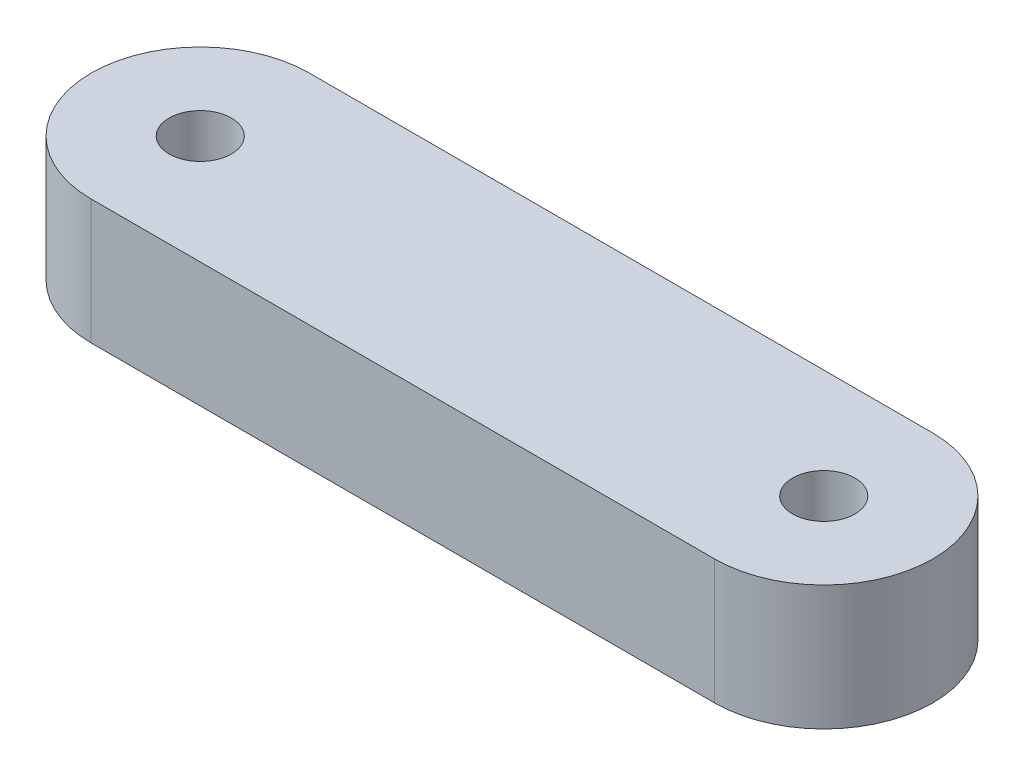
ISO-10303-21;
HEADER;
FILE_DESCRIPTION(('STEP AP214'),'2;1');
FILE_NAME('part.step','',(''),(''),'','','');
FILE_SCHEMA(('AUTOMOTIVE_DESIGN { 1 0 10303 214 1 1 1 1 }'));
ENDSEC;
DATA;
#1=APPLICATION_CONTEXT('core data for automotive mechanical design processes');
#2=APPLICATION_PROTOCOL_DEFINITION('international standard','automotive_design',2000,#1);
#3=PRODUCT_CONTEXT('',#1,'mechanical');
#4=PRODUCT('Part','Part','',(#3));
#5=PRODUCT_RELATED_PRODUCT_CATEGORY('part','',(#4));
#6=PRODUCT_DEFINITION_FORMATION('','',#4);
#7=PRODUCT_DEFINITION_CONTEXT('part definition',#1,'design');
#8=PRODUCT_DEFINITION('design','',#6,#7);
#9=PRODUCT_DEFINITION_SHAPE('','',#8);
#10=(LENGTH_UNIT() NAMED_UNIT(*) SI_UNIT(.MILLI.,.METRE.));
#11=(NAMED_UNIT(*) PLANE_ANGLE_UNIT() SI_UNIT($,.RADIAN.));
#12=(NAMED_UNIT(*) SI_UNIT($,.STERADIAN.) SOLID_ANGLE_UNIT());
#13=UNCERTAINTY_MEASURE_WITH_UNIT(LENGTH_MEASURE(1.E-05),#10,'distance_accuracy_value','');
#14=(GEOMETRIC_REPRESENTATION_CONTEXT(3) GLOBAL_UNCERTAINTY_ASSIGNED_CONTEXT((#13)) GLOBAL_UNIT_ASSIGNED_CONTEXT((#10,
#11,#12)) REPRESENTATION_CONTEXT('',''));
#15=CARTESIAN_POINT('',(0.,0.,0.));
#16=DIRECTION('',(0.,0.,1.));
#17=DIRECTION('',(1.,0.,0.));
#18=AXIS2_PLACEMENT_3D('',#15,#16,#17);
#19=CARTESIAN_POINT('',(0.,10.,0.));
#20=DIRECTION('',(0.,-1.,0.));
#21=DIRECTION('',(0.,0.,-1.));
#22=AXIS2_PLACEMENT_3D('',#19,#20,#21);
#23=PLANE('',#22);
#24=CARTESIAN_POINT('',(0.,10.,0.));
#25=DIRECTION('',(0.,1.,0.));
#26=DIRECTION('',(0.,0.,-1.));
#27=AXIS2_PLACEMENT_3D('',#24,#25,#26);
#28=CIRCLE('',#27,8.74670034060567);
#29=CARTESIAN_POINT('',(0.,10.,8.74670034060567));
#30=VERTEX_POINT('',#29);
#31=CARTESIAN_POINT('',(0.,10.,-8.74670034060567));
#32=VERTEX_POINT('',#31);
#33=EDGE_CURVE('E88',#30,#32,#28,.T.);
#34=ORIENTED_EDGE('',*,*,#33,.T.);
#35=DIRECTION('',(-1.,0.,0.));
#36=VECTOR('',#35,1.);
#37=CARTESIAN_POINT('',(0.,10.,-8.74670034060567));
#38=LINE('',#37,#36);
#39=CARTESIAN_POINT('',(-50.,10.,-8.74670034060566));
#40=VERTEX_POINT('',#39);
#41=EDGE_CURVE('E83',#32,#40,#38,.T.);
#42=ORIENTED_EDGE('',*,*,#41,.T.);
#43=CARTESIAN_POINT('',(-50.,10.,0.));
#44=DIRECTION('',(0.,1.,0.));
#45=DIRECTION('',(0.,0.,1.));
#46=AXIS2_PLACEMENT_3D('',#43,#44,#45);
#47=CIRCLE('',#46,8.74670034060567);
#48=CARTESIAN_POINT('',(-50.,10.,8.74670034060567));
#49=VERTEX_POINT('',#48);
#50=EDGE_CURVE('E86',#40,#49,#47,.T.);
#51=ORIENTED_EDGE('',*,*,#50,.T.);
#52=DIRECTION('',(1.,0.,0.));
#53=VECTOR('',#52,1.);
#54=CARTESIAN_POINT('',(0.,10.,8.74670034060567));
#55=LINE('',#54,#53);
#56=EDGE_CURVE('E53',#49,#30,#55,.T.);
#57=ORIENTED_EDGE('',*,*,#56,.T.);
#58=EDGE_LOOP('',(#34,#42,#51,#57));
#59=FACE_BOUND('',#58,.T.);
#60=CARTESIAN_POINT('',(0.,10.,0.));
#61=DIRECTION('',(0.,1.,0.));
#62=DIRECTION('',(0.,0.,1.));
#63=AXIS2_PLACEMENT_3D('',#60,#61,#62);
#64=CIRCLE('',#63,2.5);
#65=CARTESIAN_POINT('',(0.,10.,2.5));
#66=VERTEX_POINT('',#65);
#67=EDGE_CURVE('E103',#66,#66,#64,.T.);
#68=ORIENTED_EDGE('',*,*,#67,.F.);
#69=EDGE_LOOP('',(#68));
#70=FACE_BOUND('',#69,.T.);
#71=CARTESIAN_POINT('',(-50.,10.,0.));
#72=DIRECTION('',(0.,1.,0.));
#73=DIRECTION('',(0.,0.,1.));
#74=AXIS2_PLACEMENT_3D('',#71,#72,#73);
#75=CIRCLE('',#74,2.5);
#76=CARTESIAN_POINT('',(-50.,10.,2.5));
#77=VERTEX_POINT('',#76);
#78=EDGE_CURVE('E118',#77,#77,#75,.T.);
#79=ORIENTED_EDGE('',*,*,#78,.F.);
#80=EDGE_LOOP('',(#79));
#81=FACE_BOUND('',#80,.T.);
#82=ADVANCED_FACE('F36',(#59,#70,#81),#23,.F.);
#83=CARTESIAN_POINT('',(0.,0.,0.));
#84=DIRECTION('',(0.,-1.,0.));
#85=DIRECTION('',(0.,0.,-1.));
#86=AXIS2_PLACEMENT_3D('',#83,#84,#85);
#87=PLANE('',#86);
#88=CARTESIAN_POINT('',(0.,0.,0.));
#89=DIRECTION('',(0.,1.,0.));
#90=DIRECTION('',(0.,0.,1.));
#91=AXIS2_PLACEMENT_3D('',#88,#89,#90);
#92=CIRCLE('',#91,2.5);
#93=CARTESIAN_POINT('',(0.,0.,2.5));
#94=VERTEX_POINT('',#93);
#95=EDGE_CURVE('E115',#94,#94,#92,.T.);
#96=ORIENTED_EDGE('',*,*,#95,.T.);
#97=EDGE_LOOP('',(#96));
#98=FACE_BOUND('',#97,.T.);
#99=CARTESIAN_POINT('',(0.,0.,0.));
#100=DIRECTION('',(0.,1.,0.));
#101=DIRECTION('',(0.,0.,-1.));
#102=AXIS2_PLACEMENT_3D('',#99,#100,#101);
#103=CIRCLE('',#102,8.74670034060567);
#104=CARTESIAN_POINT('',(0.,0.,8.74670034060567));
#105=VERTEX_POINT('',#104);
#106=CARTESIAN_POINT('',(0.,0.,-8.74670034060567));
#107=VERTEX_POINT('',#106);
#108=EDGE_CURVE('E100',#105,#107,#103,.T.);
#109=ORIENTED_EDGE('',*,*,#108,.F.);
#110=DIRECTION('',(1.,0.,0.));
#111=VECTOR('',#110,1.);
#112=CARTESIAN_POINT('',(0.,0.,8.74670034060567));
#113=LINE('',#112,#111);
#114=CARTESIAN_POINT('',(-50.,0.,8.74670034060567));
#115=VERTEX_POINT('',#114);
#116=EDGE_CURVE('E76',#115,#105,#113,.T.);
#117=ORIENTED_EDGE('',*,*,#116,.F.);
#118=CARTESIAN_POINT('',(-50.,0.,0.));
#119=DIRECTION('',(0.,1.,0.));
#120=DIRECTION('',(0.,0.,1.));
#121=AXIS2_PLACEMENT_3D('',#118,#119,#120);
#122=CIRCLE('',#121,8.74670034060567);
#123=CARTESIAN_POINT('',(-50.,0.,-8.74670034060566));
#124=VERTEX_POINT('',#123);
#125=EDGE_CURVE('E70',#124,#115,#122,.T.);
#126=ORIENTED_EDGE('',*,*,#125,.F.);
#127=DIRECTION('',(-1.,0.,0.));
#128=VECTOR('',#127,1.);
#129=CARTESIAN_POINT('',(0.,0.,-8.74670034060567));
#130=LINE('',#129,#128);
#131=EDGE_CURVE('E92',#107,#124,#130,.T.);
#132=ORIENTED_EDGE('',*,*,#131,.F.);
#133=EDGE_LOOP('',(#109,#117,#126,#132));
#134=FACE_BOUND('',#133,.T.);
#135=CARTESIAN_POINT('',(-50.,0.,0.));
#136=DIRECTION('',(0.,1.,0.));
#137=DIRECTION('',(0.,0.,1.));
#138=AXIS2_PLACEMENT_3D('',#135,#136,#137);
#139=CIRCLE('',#138,2.5);
#140=CARTESIAN_POINT('',(-50.,0.,2.5));
#141=VERTEX_POINT('',#140);
#142=EDGE_CURVE('E121',#141,#141,#139,.T.);
#143=ORIENTED_EDGE('',*,*,#142,.T.);
#144=EDGE_LOOP('',(#143));
#145=FACE_BOUND('',#144,.T.);
#146=ADVANCED_FACE('F111',(#98,#134,#145),#87,.T.);
#147=CARTESIAN_POINT('',(0.,10.,0.));
#148=DIRECTION('',(0.,-1.,0.));
#149=DIRECTION('',(0.,0.,-1.));
#150=AXIS2_PLACEMENT_3D('',#147,#148,#149);
#151=CYLINDRICAL_SURFACE('',#150,8.74670034060567);
#152=ORIENTED_EDGE('',*,*,#108,.T.);
#153=DIRECTION('',(0.,-1.,0.));
#154=VECTOR('',#153,1.);
#155=CARTESIAN_POINT('',(0.,10.,-8.74670034060567));
#156=LINE('',#155,#154);
#157=EDGE_CURVE('E11',#32,#107,#156,.T.);
#158=ORIENTED_EDGE('',*,*,#157,.F.);
#159=ORIENTED_EDGE('',*,*,#33,.F.);
#160=DIRECTION('',(0.,-1.,0.));
#161=VECTOR('',#160,1.);
#162=CARTESIAN_POINT('',(0.,10.,8.74670034060567));
#163=LINE('',#162,#161);
#164=EDGE_CURVE('E96',#30,#105,#163,.T.);
#165=ORIENTED_EDGE('',*,*,#164,.T.);
#166=EDGE_LOOP('',(#152,#158,#159,#165));
#167=FACE_BOUND('',#166,.T.);
#168=ADVANCED_FACE('F38',(#167),#151,.T.);
#169=CARTESIAN_POINT('',(0.,10.,-8.74670034060567));
#170=DIRECTION('',(0.,0.,1.));
#171=DIRECTION('',(1.,0.,0.));
#172=AXIS2_PLACEMENT_3D('',#169,#170,#171);
#173=PLANE('',#172);
#174=ORIENTED_EDGE('',*,*,#131,.T.);
#175=DIRECTION('',(0.,-1.,0.));
#176=VECTOR('',#175,1.);
#177=CARTESIAN_POINT('',(-50.,10.,-8.74670034060566));
#178=LINE('',#177,#176);
#179=EDGE_CURVE('E45',#40,#124,#178,.T.);
#180=ORIENTED_EDGE('',*,*,#179,.F.);
#181=ORIENTED_EDGE('',*,*,#41,.F.);
#182=ORIENTED_EDGE('',*,*,#157,.T.);
#183=EDGE_LOOP('',(#174,#180,#181,#182));
#184=FACE_BOUND('',#183,.T.);
#185=ADVANCED_FACE('F91',(#184),#173,.F.);
#186=CARTESIAN_POINT('',(-50.,10.,0.));
#187=DIRECTION('',(0.,-1.,0.));
#188=DIRECTION('',(0.,0.,-1.));
#189=AXIS2_PLACEMENT_3D('',#186,#187,#188);
#190=CYLINDRICAL_SURFACE('',#189,8.74670034060567);
#191=ORIENTED_EDGE('',*,*,#125,.T.);
#192=DIRECTION('',(0.,-1.,0.));
#193=VECTOR('',#192,1.);
#194=CARTESIAN_POINT('',(-50.,10.,8.74670034060567));
#195=LINE('',#194,#193);
#196=EDGE_CURVE('E93',#49,#115,#195,.T.);
#197=ORIENTED_EDGE('',*,*,#196,.F.);
#198=ORIENTED_EDGE('',*,*,#50,.F.);
#199=ORIENTED_EDGE('',*,*,#179,.T.);
#200=EDGE_LOOP('',(#191,#197,#198,#199));
#201=FACE_BOUND('',#200,.T.);
#202=ADVANCED_FACE('F94',(#201),#190,.T.);
#203=CARTESIAN_POINT('',(0.,10.,8.74670034060567));
#204=DIRECTION('',(0.,0.,-1.));
#205=DIRECTION('',(-1.,0.,0.));
#206=AXIS2_PLACEMENT_3D('',#203,#204,#205);
#207=PLANE('',#206);
#208=ORIENTED_EDGE('',*,*,#116,.T.);
#209=ORIENTED_EDGE('',*,*,#164,.F.);
#210=ORIENTED_EDGE('',*,*,#56,.F.);
#211=ORIENTED_EDGE('',*,*,#196,.T.);
#212=EDGE_LOOP('',(#208,#209,#210,#211));
#213=FACE_BOUND('',#212,.T.);
#214=ADVANCED_FACE('F108',(#213),#207,.F.);
#215=CARTESIAN_POINT('',(0.,10.,0.));
#216=DIRECTION('',(0.,-1.,0.));
#217=DIRECTION('',(0.,0.,-1.));
#218=AXIS2_PLACEMENT_3D('',#215,#216,#217);
#219=CYLINDRICAL_SURFACE('',#218,2.5);
#220=ORIENTED_EDGE('',*,*,#67,.T.);
#221=EDGE_LOOP('',(#220));
#222=FACE_BOUND('',#221,.T.);
#223=ORIENTED_EDGE('',*,*,#95,.F.);
#224=EDGE_LOOP('',(#223));
#225=FACE_BOUND('',#224,.T.);
#226=ADVANCED_FACE('F138',(#222,#225),#219,.F.);
#227=CARTESIAN_POINT('',(-50.,10.,0.));
#228=DIRECTION('',(0.,-1.,0.));
#229=DIRECTION('',(0.,0.,-1.));
#230=AXIS2_PLACEMENT_3D('',#227,#228,#229);
#231=CYLINDRICAL_SURFACE('',#230,2.5);
#232=ORIENTED_EDGE('',*,*,#78,.T.);
#233=EDGE_LOOP('',(#232));
#234=FACE_BOUND('',#233,.T.);
#235=ORIENTED_EDGE('',*,*,#142,.F.);
#236=EDGE_LOOP('',(#235));
#237=FACE_BOUND('',#236,.T.);
#238=ADVANCED_FACE('F127',(#234,#237),#231,.F.);
#239=CLOSED_SHELL('',(#82,#146,#168,#185,#202,#214,#226,#238));
#240=MANIFOLD_SOLID_BREP('B2',#239);
#241=ADVANCED_BREP_SHAPE_REPRESENTATION('',(#18,#240),#14);
#242=SHAPE_DEFINITION_REPRESENTATION(#9,#241);
ENDSEC;
END-ISO-10303-21;
